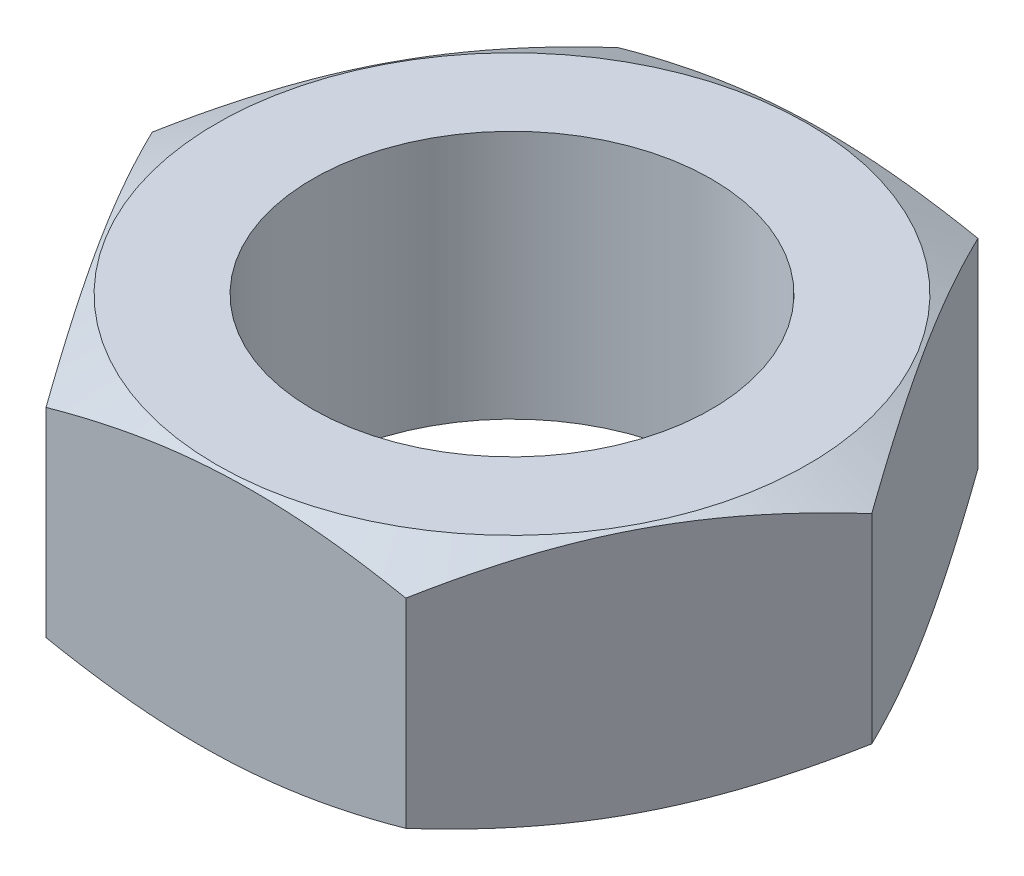
ISO-10303-21;
HEADER;
FILE_DESCRIPTION(('STEP AP214'),'2;1');
FILE_NAME('part.step','',(''),(''),'','','');
FILE_SCHEMA(('AUTOMOTIVE_DESIGN { 1 0 10303 214 1 1 1 1 }'));
ENDSEC;
DATA;
#1=APPLICATION_CONTEXT('core data for automotive mechanical design processes');
#2=APPLICATION_PROTOCOL_DEFINITION('international standard','automotive_design',2000,#1);
#3=PRODUCT_CONTEXT('',#1,'mechanical');
#4=PRODUCT('Part','Part','',(#3));
#5=PRODUCT_RELATED_PRODUCT_CATEGORY('part','',(#4));
#6=PRODUCT_DEFINITION_FORMATION('','',#4);
#7=PRODUCT_DEFINITION_CONTEXT('part definition',#1,'design');
#8=PRODUCT_DEFINITION('design','',#6,#7);
#9=PRODUCT_DEFINITION_SHAPE('','',#8);
#10=(LENGTH_UNIT() NAMED_UNIT(*) SI_UNIT(.MILLI.,.METRE.));
#11=(NAMED_UNIT(*) PLANE_ANGLE_UNIT() SI_UNIT($,.RADIAN.));
#12=(NAMED_UNIT(*) SI_UNIT($,.STERADIAN.) SOLID_ANGLE_UNIT());
#13=UNCERTAINTY_MEASURE_WITH_UNIT(LENGTH_MEASURE(1.E-05),#10,'distance_accuracy_value','');
#14=(GEOMETRIC_REPRESENTATION_CONTEXT(3) GLOBAL_UNCERTAINTY_ASSIGNED_CONTEXT((#13)) GLOBAL_UNIT_ASSIGNED_CONTEXT((#10,
#11,#12)) REPRESENTATION_CONTEXT('',''));
#15=CARTESIAN_POINT('',(0.,0.,0.));
#16=DIRECTION('',(0.,0.,1.));
#17=DIRECTION('',(1.,0.,0.));
#18=AXIS2_PLACEMENT_3D('',#15,#16,#17);
#19=CARTESIAN_POINT('',(6.92194014924689,4.99999999999999,-0.29452431180485));
#20=DIRECTION('',(-0.843987057317929,0.,0.536363540035881));
#21=DIRECTION('',(0.536363540035881,0.,0.843987057317929));
#22=AXIS2_PLACEMENT_3D('',#19,#20,#21);
#23=PLANE('',#22);
#24=CARTESIAN_POINT('',(3.20577743625425,0.500059244134363,-6.14203816862569));
#25=CARTESIAN_POINT('',(3.31051461271701,0.451242167989356,-5.97723050599319));
#26=CARTESIAN_POINT('',(3.41565983679377,0.405322077135247,-5.81178076596491));
#27=CARTESIAN_POINT('',(3.62678777444964,0.320242852522635,-5.47956346646714));
#28=CARTESIAN_POINT('',(3.73277089012844,0.281087200512654,-5.31279527427952));
#29=CARTESIAN_POINT('',(3.9456458760564,0.210503775262007,-4.97782893235048));
#30=CARTESIAN_POINT('',(4.052538859268,0.179087527040338,-4.80962903132315));
#31=CARTESIAN_POINT('',(4.26694862943603,0.12502636456731,-4.4722476519471));
#32=CARTESIAN_POINT('',(4.37446530562581,0.102379938463995,-4.30306634789362));
#33=CARTESIAN_POINT('',(4.58751662943403,0.067053718197412,-3.96782253205453));
#34=CARTESIAN_POINT('',(4.69304094838088,0.0541596026635657,-3.80177627280008));
#35=CARTESIAN_POINT('',(4.90430926275757,0.0379825701147827,-3.46933808555236));
#36=CARTESIAN_POINT('',(5.01005326876448,0.0347001271243317,-3.30294614091569));
#37=CARTESIAN_POINT('',(5.22138456230621,0.0378737368355456,-2.97040885371764));
#38=CARTESIAN_POINT('',(5.32697189592753,0.044319298998566,-2.80426343863751));
#39=CARTESIAN_POINT('',(5.53784564394487,0.0666811412258578,-2.47244611555316));
#40=CARTESIAN_POINT('',(5.64313208322616,0.0825966138886576,-2.30677416839106));
#41=CARTESIAN_POINT('',(5.84659638686395,0.122040366527397,-1.98661586888208));
#42=CARTESIAN_POINT('',(5.94480490127157,0.14502695347487,-1.83208128759249));
#43=CARTESIAN_POINT('',(6.14067023294311,0.198156963128978,-1.52388024003991));
#44=CARTESIAN_POINT('',(6.23832699019221,0.228301149591202,-1.3702138682124));
#45=CARTESIAN_POINT('',(6.43408807357483,0.295367911562853,-1.06217685904057));
#46=CARTESIAN_POINT('',(6.53218524693089,0.332362326408422,-0.907817476845322));
#47=CARTESIAN_POINT('',(6.72765976548517,0.41209697586328,-0.60023138759656));
#48=CARTESIAN_POINT('',(6.82503742494812,0.454834523716835,-0.447004186036328));
#49=CARTESIAN_POINT('',(6.92206725156093,0.500059244134363,-0.2943243118049));
#50=B_SPLINE_CURVE_WITH_KNOTS('',3,(#24,#25,#26,#27,#28,#29,#30,#31,#32,#33,#34,#35,#36,#37,#38,
#39,#40,#41,#42,#43,#44,#45,#46,#47,#48,#49),.UNSPECIFIED.,.F.,.F.,(4,2,2,2,2,2,2,2,2,2,2,2,4),
(0.,0.603877639840611,1.20806518358095,1.81314707831542,2.41812461495599,3.00938619577932,
3.60067693570533,4.19133049177801,4.78193369613622,5.33539537231975,5.88891613249634,
6.44860936518251,7.00804166751778),.UNSPECIFIED.);
#51=CARTESIAN_POINT('',(3.20590453856827,0.5,-6.14183816862572));
#52=VERTEX_POINT('',#51);
#53=CARTESIAN_POINT('',(6.92194014924689,0.5,-0.294524311804892));
#54=VERTEX_POINT('',#53);
#55=EDGE_CURVE('E57',#52,#54,#50,.T.);
#56=ORIENTED_EDGE('',*,*,#55,.F.);
#57=DIRECTION('',(0.,-1.,0.));
#58=VECTOR('',#57,1.);
#59=CARTESIAN_POINT('',(3.20590453856828,4.99999999999999,-6.14183816862568));
#60=LINE('',#59,#58);
#61=CARTESIAN_POINT('',(3.20590453856827,4.49999999999999,-6.14183816862572));
#62=VERTEX_POINT('',#61);
#63=EDGE_CURVE('E50',#62,#52,#60,.T.);
#64=ORIENTED_EDGE('',*,*,#63,.F.);
#65=CARTESIAN_POINT('',(6.92206725156093,4.49994075586564,-0.2943243118049));
#66=CARTESIAN_POINT('',(6.81733007509815,4.54875783201066,-0.459131974437378));
#67=CARTESIAN_POINT('',(6.71218485102138,4.59467792286477,-0.624581714465653));
#68=CARTESIAN_POINT('',(6.50105691336551,4.67975714747739,-0.956799013963414));
#69=CARTESIAN_POINT('',(6.39507379768671,4.71891279948737,-1.12356720615103));
#70=CARTESIAN_POINT('',(6.18219881175876,4.78949622473801,-1.45853354808008));
#71=CARTESIAN_POINT('',(6.07530582854715,4.82091247295968,-1.6267334491074));
#72=CARTESIAN_POINT('',(5.86089605837912,4.87497363543271,-1.96411482848344));
#73=CARTESIAN_POINT('',(5.75337938218935,4.89762006153603,-2.13329613253693));
#74=CARTESIAN_POINT('',(5.54032805838113,4.93294628180261,-2.46853994837601));
#75=CARTESIAN_POINT('',(5.43480373943428,4.94584039733646,-2.63458620763046));
#76=CARTESIAN_POINT('',(5.2235354250576,4.96201742988524,-2.96702439487817));
#77=CARTESIAN_POINT('',(5.11779141905069,4.96529987287569,-3.13341633951485));
#78=CARTESIAN_POINT('',(4.90646012550896,4.96212626316448,-3.4659536267129));
#79=CARTESIAN_POINT('',(4.80087279188763,4.95568070100146,-3.63209904179302));
#80=CARTESIAN_POINT('',(4.5899990438703,4.93331885877416,-3.96391636487737));
#81=CARTESIAN_POINT('',(4.48471260458902,4.91740338611135,-4.12958831203947));
#82=CARTESIAN_POINT('',(4.28124830095122,4.87795963347261,-4.44974661154845));
#83=CARTESIAN_POINT('',(4.1830397865436,4.85497304652515,-4.60428119283805));
#84=CARTESIAN_POINT('',(3.98717445487204,4.80184303687105,-4.91248224039064));
#85=CARTESIAN_POINT('',(3.88951769762295,4.77169885040883,-5.06614861221815));
#86=CARTESIAN_POINT('',(3.69375661424033,4.70463208843717,-5.37418562138998));
#87=CARTESIAN_POINT('',(3.59565944088426,4.6676376735916,-5.52854500358523));
#88=CARTESIAN_POINT('',(3.40018492232998,4.58790302413674,-5.836131092834));
#89=CARTESIAN_POINT('',(3.30280726286704,4.54516547628318,-5.98935829439424));
#90=CARTESIAN_POINT('',(3.20577743625425,4.49994075586564,-6.14203816862569));
#91=B_SPLINE_CURVE_WITH_KNOTS('',3,(#65,#66,#67,#68,#69,#70,#71,#72,#73,#74,#75,#76,#77,#78,#79,
#80,#81,#82,#83,#84,#85,#86,#87,#88,#89,#90),.UNSPECIFIED.,.F.,.F.,(4,2,2,2,2,2,2,2,2,2,2,2,4),
(0.,0.603877639840608,1.20806518358095,1.81314707831541,2.41812461495597,3.00938619577929,
3.60067693570529,4.19133049177798,4.78193369613617,5.33539537231972,5.88891613249633,
6.44860936518251,7.00804166751779),.UNSPECIFIED.);
#92=CARTESIAN_POINT('',(6.92194014924689,4.49999999999999,-0.294524311804892));
#93=VERTEX_POINT('',#92);
#94=EDGE_CURVE('E129',#93,#62,#91,.T.);
#95=ORIENTED_EDGE('',*,*,#94,.F.);
#96=DIRECTION('',(0.,-1.,0.));
#97=VECTOR('',#96,1.);
#98=CARTESIAN_POINT('',(6.92194014924689,4.99999999999999,-0.29452431180485));
#99=LINE('',#98,#97);
#100=EDGE_CURVE('E106',#93,#54,#99,.T.);
#101=ORIENTED_EDGE('',*,*,#100,.T.);
#102=EDGE_LOOP('',(#56,#64,#95,#101));
#103=FACE_BOUND('',#102,.T.);
#104=ADVANCED_FACE('F36',(#103),#23,.F.);
#105=CARTESIAN_POINT('',(3.20590453856828,4.99999999999999,-6.14183816862568));
#106=DIRECTION('',(0.0425109226758603,0.,0.999096002120541));
#107=DIRECTION('',(0.999096002120541,0.,-0.0425109226758603));
#108=AXIS2_PLACEMENT_3D('',#105,#106,#107);
#109=PLANE('',#108);
#110=CARTESIAN_POINT('',(-3.7162356106786,0.500050046325265,-5.84730534694337));
#111=CARTESIAN_POINT('',(-3.52114020071808,0.451233558614801,-5.85560653708889));
#112=CARTESIAN_POINT('',(-3.32528471681809,0.405314059799307,-5.86394006791479));
#113=CARTESIAN_POINT('',(-2.93201375612219,0.320236014630059,-5.88067350630842));
#114=CARTESIAN_POINT('',(-2.73459753034356,0.281080949979113,-5.88907344574489));
#115=CARTESIAN_POINT('',(-2.33807235749717,0.210498685060836,-5.90594534887145));
#116=CARTESIAN_POINT('',(-2.13896133741976,0.179083009232149,-5.91441740076682));
#117=CARTESIAN_POINT('',(-1.73957734853946,0.125022953780818,-5.93141094476382));
#118=CARTESIAN_POINT('',(-1.53930458605811,0.102377062325003,-5.9399324280866));
#119=CARTESIAN_POINT('',(-1.14245097661922,0.0670518354946798,-5.95681830598891));
#120=CARTESIAN_POINT('',(-0.945889368282945,0.0541581827603798,-5.9651818819769));
#121=CARTESIAN_POINT('',(-0.552356977701126,0.0379820046590569,-5.98192644405197));
#122=CARTESIAN_POINT('',(-0.355386175754202,0.0346999533207474,-5.99030743097735));
#123=CARTESIAN_POINT('',(0.0382634945396491,0.0378742585634858,-6.00705698323231));
#124=CARTESIAN_POINT('',(0.234942448749098,0.0443201249688456,-6.01542555221529));
#125=CARTESIAN_POINT('',(0.627739819187143,0.0666824798028249,-6.03213883963365));
#126=CARTESIAN_POINT('',(0.823858281771413,0.0825981608286952,-6.04048356004143));
#127=CARTESIAN_POINT('',(1.20285030932616,0.122041842620647,-6.05660943857958));
#128=CARTESIAN_POINT('',(1.38578098333762,0.145028000646343,-6.06439302666465));
#129=CARTESIAN_POINT('',(1.75061471911711,0.198156800261064,-6.07991647856352));
#130=CARTESIAN_POINT('',(1.93251766912306,0.228300205407827,-6.08765633762191));
#131=CARTESIAN_POINT('',(2.29715721003365,0.295365085554234,-6.1031715266481));
#132=CARTESIAN_POINT('',(2.47988047841606,0.332358394191379,-6.11094628975074));
#133=CARTESIAN_POINT('',(2.84398624861007,0.412090582872495,-6.12643876716002));
#134=CARTESIAN_POINT('',(3.02536933572355,0.454826776537646,-6.1341565063709));
#135=CARTESIAN_POINT('',(3.20610453856829,0.500050046325265,-6.14184667850315));
#136=B_SPLINE_CURVE_WITH_KNOTS('',3,(#110,#111,#112,#113,#114,#115,#116,#117,#118,#119,#120,
#121,#122,#123,#124,#125,#126,#127,#128,#129,#130,#131,#132,#133,#134,#135),.UNSPECIFIED.,.F.,
.F.,(4,2,2,2,2,2,2,2,2,2,2,2,4),(0.,0.603874878153549,1.20805965495954,1.81313873570023,
2.41811345968106,3.00937246524377,3.60066063025813,4.19131163052815,4.78191227871234,
5.33536052994546,5.8888678513365,6.44854729264458,7.00796583529322),.UNSPECIFIED.);
#137=CARTESIAN_POINT('',(-3.71603561067858,0.5,-5.8473138568208));
#138=VERTEX_POINT('',#137);
#139=EDGE_CURVE('E92',#138,#52,#136,.T.);
#140=ORIENTED_EDGE('',*,*,#139,.F.);
#141=DIRECTION('',(0.,-1.,0.));
#142=VECTOR('',#141,1.);
#143=CARTESIAN_POINT('',(-3.71603561067858,4.99999999999999,-5.8473138568208));
#144=LINE('',#143,#142);
#145=CARTESIAN_POINT('',(-3.71603561067858,4.49999999999999,-5.8473138568208));
#146=VERTEX_POINT('',#145);
#147=EDGE_CURVE('E112',#146,#138,#144,.T.);
#148=ORIENTED_EDGE('',*,*,#147,.F.);
#149=CARTESIAN_POINT('',(3.20610453856829,4.49994995367474,-6.14184667850315));
#150=CARTESIAN_POINT('',(3.01100912860776,4.54876644138521,-6.1335454883576));
#151=CARTESIAN_POINT('',(2.81515364470778,4.59468594020071,-6.12521195753168));
#152=CARTESIAN_POINT('',(2.42188268401187,4.67976398536996,-6.10847851913805));
#153=CARTESIAN_POINT('',(2.22446645823324,4.71891905002091,-6.10007857970158));
#154=CARTESIAN_POINT('',(1.82794128538685,4.78950131493918,-6.08320667657502));
#155=CARTESIAN_POINT('',(1.62883026530944,4.82091699076787,-6.07473462467965));
#156=CARTESIAN_POINT('',(1.22944627642914,4.8749770462192,-6.05774108068265));
#157=CARTESIAN_POINT('',(1.02917351394779,4.89762293767502,-6.04921959735987));
#158=CARTESIAN_POINT('',(0.632319904508897,4.93294816450534,-6.03233371945756));
#159=CARTESIAN_POINT('',(0.435758296172623,4.94584181723964,-6.02397014346958));
#160=CARTESIAN_POINT('',(0.0422259055908026,4.96201799534096,-6.0072255813945));
#161=CARTESIAN_POINT('',(-0.154744896356122,4.96530004667927,-5.99884459446912));
#162=CARTESIAN_POINT('',(-0.548394566649975,4.96212574143653,-5.98209504221416));
#163=CARTESIAN_POINT('',(-0.745073520859425,4.95567987503117,-5.97372647323118));
#164=CARTESIAN_POINT('',(-1.13787089129747,4.93331752019719,-5.95701318581282));
#165=CARTESIAN_POINT('',(-1.33398935388174,4.91740183917131,-5.94866846540503));
#166=CARTESIAN_POINT('',(-1.71298138143649,4.87795815737936,-5.93254258686688));
#167=CARTESIAN_POINT('',(-1.89591205544794,4.85497199935367,-5.92475899878182));
#168=CARTESIAN_POINT('',(-2.26074579122743,4.80184319973895,-5.90923554688296));
#169=CARTESIAN_POINT('',(-2.44264874123339,4.77169979459219,-5.90149568782457));
#170=CARTESIAN_POINT('',(-2.80728828214397,4.70463491444578,-5.88598049879837));
#171=CARTESIAN_POINT('',(-2.99001155052638,4.66764160580864,-5.87820573569573));
#172=CARTESIAN_POINT('',(-3.35411732072038,4.58790941712752,-5.86271325828646));
#173=CARTESIAN_POINT('',(-3.53550040783386,4.54517322346237,-5.85499551907559));
#174=CARTESIAN_POINT('',(-3.7162356106786,4.49994995367474,-5.84730534694337));
#175=B_SPLINE_CURVE_WITH_KNOTS('',3,(#149,#150,#151,#152,#153,#154,#155,#156,#157,#158,#159,
#160,#161,#162,#163,#164,#165,#166,#167,#168,#169,#170,#171,#172,#173,#174),.UNSPECIFIED.,.F.,
.F.,(4,2,2,2,2,2,2,2,2,2,2,2,4),(0.,0.603874878153553,1.20805965495955,1.81313873570024,
2.41811345968107,3.00937246524378,3.60066063025814,4.19131163052816,4.78191227871236,
5.33536052994548,5.88886785133651,6.44854729264458,7.00796583529323),.UNSPECIFIED.);
#176=EDGE_CURVE('E111',#62,#146,#175,.T.);
#177=ORIENTED_EDGE('',*,*,#176,.F.);
#178=ORIENTED_EDGE('',*,*,#63,.T.);
#179=EDGE_LOOP('',(#140,#148,#177,#178));
#180=FACE_BOUND('',#179,.T.);
#181=ADVANCED_FACE('F110',(#180),#109,.F.);
#182=CARTESIAN_POINT('',(-3.71603561067858,4.99999999999999,-5.8473138568208));
#183=DIRECTION('',(0.88649797999379,0.,0.462732462084659));
#184=DIRECTION('',(0.462732462084659,0.,-0.88649797999379));
#185=AXIS2_PLACEMENT_3D('',#182,#183,#184);
#186=PLANE('',#185);
#187=CARTESIAN_POINT('',(-6.92204454485126,0.500056403085217,0.294724311804884));
#188=CARTESIAN_POINT('',(-6.83168562507424,0.451239508697742,0.121615644442595));
#189=CARTESIAN_POINT('',(-6.74097467451268,0.40531960071437,-0.0521674397911348));
#190=CARTESIAN_POINT('',(-6.5588302554546,0.32024074041184,-0.40111780051293));
#191=CARTESIAN_POINT('',(-6.4673964400604,0.281085269827085,-0.57628574158392));
#192=CARTESIAN_POINT('',(-6.28374481207704,0.210502202983332,-0.928123597299429));
#193=CARTESIAN_POINT('',(-6.19152603932957,0.179086131564069,-1.10479535140512));
#194=CARTESIAN_POINT('',(-6.0065503282505,0.125025311031029,-1.45916987157766));
#195=CARTESIAN_POINT('',(-5.91379348547884,0.102379050071098,-1.63687245457177));
#196=CARTESIAN_POINT('',(-5.72998973153027,0.0670531366596826,-1.98900175161011));
#197=CARTESIAN_POINT('',(-5.63895173100518,0.0541591640764888,-2.16341139472133));
#198=CARTESIAN_POINT('',(-5.45668621346922,0.037982395451379,-2.51259375463234));
#199=CARTESIAN_POINT('',(-5.36545868733338,0.0347000734352545,-2.68736648891364));
#200=CARTESIAN_POINT('',(-5.18313884101852,0.0378738979834902,-3.03665293132737));
#201=CARTESIAN_POINT('',(-5.09204648107736,0.044319554121318,-3.21116671563571));
#202=CARTESIAN_POINT('',(-4.91012137205678,0.0666815546830291,-3.5596969244962));
#203=CARTESIAN_POINT('',(-4.81928860150811,0.0825970917050462,-3.73371339017893));
#204=CARTESIAN_POINT('',(-4.64375629735216,0.122040822460929,-4.06999633077244));
#205=CARTESIAN_POINT('',(-4.55903031891669,0.145027276922638,-4.23231346840671));
#206=CARTESIAN_POINT('',(-4.39005431656035,0.1981569128175,-4.55603591502624));
#207=CARTESIAN_POINT('',(-4.30580434441144,0.228300857945126,-4.7174411248273));
#208=CARTESIAN_POINT('',(-4.13691828064887,0.295367038653622,-5.0409912680356));
#209=CARTESIAN_POINT('',(-4.05228835973247,0.332361111810394,-5.20312437968596));
#210=CARTESIAN_POINT('',(-3.88364951883075,0.412095001174417,-5.52620089593981));
#211=CARTESIAN_POINT('',(-3.79964032773469,0.454832130742358,-5.68714481993438));
#212=CARTESIAN_POINT('',(-3.7159312150742,0.500056403085217,-5.84751385682082));
#213=B_SPLINE_CURVE_WITH_KNOTS('',3,(#187,#188,#189,#190,#191,#192,#193,#194,#195,#196,#197,
#198,#199,#200,#201,#202,#203,#204,#205,#206,#207,#208,#209,#210,#211,#212),.UNSPECIFIED.,.F.,
.F.,(4,2,2,2,2,2,2,2,2,2,2,2,4),(0.,0.603876786798303,1.20806347587554,1.81314450141095,
2.41812116926452,3.00938195462966,3.60067189920528,4.19132466583007,4.78192708062567,
5.33538461008929,5.88890121927241,6.44859019205446,7.00801824427477),.UNSPECIFIED.);
#214=CARTESIAN_POINT('',(-6.92194014924687,0.5,0.294524311804878));
#215=VERTEX_POINT('',#214);
#216=EDGE_CURVE('E95',#215,#138,#213,.T.);
#217=ORIENTED_EDGE('',*,*,#216,.F.);
#218=DIRECTION('',(0.,-1.,0.));
#219=VECTOR('',#218,1.);
#220=CARTESIAN_POINT('',(-6.92194014924687,4.99999999999999,0.294524311804906));
#221=LINE('',#220,#219);
#222=CARTESIAN_POINT('',(-6.92194014924687,4.49999999999999,0.294524311804878));
#223=VERTEX_POINT('',#222);
#224=EDGE_CURVE('E113',#223,#215,#221,.T.);
#225=ORIENTED_EDGE('',*,*,#224,.F.);
#226=CARTESIAN_POINT('',(-3.7159312150742,4.49994359691479,-5.84751385682082));
#227=CARTESIAN_POINT('',(-3.80629013485121,4.54876049130226,-5.67440518945852));
#228=CARTESIAN_POINT('',(-3.89700108541277,4.59468039928564,-5.50062210522479));
#229=CARTESIAN_POINT('',(-4.07914550447084,4.67975925958817,-5.15167174450298));
#230=CARTESIAN_POINT('',(-4.17057931986504,4.71891473017292,-4.97650380343199));
#231=CARTESIAN_POINT('',(-4.3542309478484,4.78949779701668,-4.62466594771648));
#232=CARTESIAN_POINT('',(-4.44644972059588,4.82091386843594,-4.44799419361079));
#233=CARTESIAN_POINT('',(-4.63142543167495,4.87497468896898,-4.09361967343825));
#234=CARTESIAN_POINT('',(-4.7241822744466,4.89762094992891,-3.91591709044413));
#235=CARTESIAN_POINT('',(-4.90798602839518,4.93294686334033,-3.5637877934058));
#236=CARTESIAN_POINT('',(-4.99902402892027,4.94584083592352,-3.38937815029457));
#237=CARTESIAN_POINT('',(-5.18128954645623,4.96201760454863,-3.04019579038356));
#238=CARTESIAN_POINT('',(-5.27251707259207,4.96529992656475,-2.86542305610226));
#239=CARTESIAN_POINT('',(-5.45483691890693,4.96212610201652,-2.51613661368852));
#240=CARTESIAN_POINT('',(-5.54592927884809,4.9556804458787,-2.34162282938017));
#241=CARTESIAN_POINT('',(-5.72785438786868,4.93331844531698,-1.99309262051969));
#242=CARTESIAN_POINT('',(-5.81868715841737,4.91740290829495,-1.81907615483697));
#243=CARTESIAN_POINT('',(-5.99421946257332,4.87795917753906,-1.48279321424346));
#244=CARTESIAN_POINT('',(-6.07894544100877,4.85497272307737,-1.32047607660919));
#245=CARTESIAN_POINT('',(-6.2479214433651,4.80184308718252,-0.996753629989655));
#246=CARTESIAN_POINT('',(-6.33217141551401,4.77169914205489,-0.835348420188599));
#247=CARTESIAN_POINT('',(-6.50105747927658,4.70463296134639,-0.511798276980304));
#248=CARTESIAN_POINT('',(-6.58568740019297,4.66763888818962,-0.349665165329948));
#249=CARTESIAN_POINT('',(-6.7543262410947,4.5879049988256,-0.026588649076102));
#250=CARTESIAN_POINT('',(-6.83833543219076,4.54516786925766,0.134355274918462));
#251=CARTESIAN_POINT('',(-6.92204454485126,4.49994359691479,0.294724311804884));
#252=B_SPLINE_CURVE_WITH_KNOTS('',3,(#226,#227,#228,#229,#230,#231,#232,#233,#234,#235,#236,
#237,#238,#239,#240,#241,#242,#243,#244,#245,#246,#247,#248,#249,#250,#251),.UNSPECIFIED.,.F.,
.F.,(4,2,2,2,2,2,2,2,2,2,2,2,4),(0.,0.60387678679831,1.20806347587555,1.81314450141096,
2.41812116926454,3.00938195462969,3.60067189920531,4.19132466583011,4.78192708062572,
5.33538461008932,5.88890121927244,6.44859019205447,7.00801824427477),.UNSPECIFIED.);
#253=EDGE_CURVE('E166',#146,#223,#252,.T.);
#254=ORIENTED_EDGE('',*,*,#253,.F.);
#255=ORIENTED_EDGE('',*,*,#147,.T.);
#256=EDGE_LOOP('',(#217,#225,#254,#255));
#257=FACE_BOUND('',#256,.T.);
#258=ADVANCED_FACE('F171',(#257),#186,.F.);
#259=CARTESIAN_POINT('',(-6.92194014924687,4.99999999999999,0.294524311804906));
#260=DIRECTION('',(0.843987057317929,0.,-0.536363540035882));
#261=DIRECTION('',(-0.536363540035882,0.,-0.843987057317929));
#262=AXIS2_PLACEMENT_3D('',#259,#260,#261);
#263=PLANE('',#262);
#264=CARTESIAN_POINT('',(-3.20577743625421,0.500059244134363,6.14203816862569));
#265=CARTESIAN_POINT('',(-3.31051461271699,0.451242167989361,5.97723050599321));
#266=CARTESIAN_POINT('',(-3.41565983679376,0.405322077135254,5.81178076596493));
#267=CARTESIAN_POINT('',(-3.62678777444963,0.320242852522643,5.47956346646717));
#268=CARTESIAN_POINT('',(-3.73277089012843,0.281087200512661,5.31279527427955));
#269=CARTESIAN_POINT('',(-3.94564587605638,0.210503775262014,4.9778289323505));
#270=CARTESIAN_POINT('',(-4.05253885926799,0.179087527040345,4.80962903132319));
#271=CARTESIAN_POINT('',(-4.26694862943602,0.125026364567317,4.47224765194713));
#272=CARTESIAN_POINT('',(-4.3744653056258,0.102379938464001,4.30306634789365));
#273=CARTESIAN_POINT('',(-4.58751662943402,0.0670537181974177,3.96782253205457));
#274=CARTESIAN_POINT('',(-4.69304094838087,0.0541596026635706,3.80177627280012));
#275=CARTESIAN_POINT('',(-4.90430926275755,0.0379825701147863,3.4693380855524));
#276=CARTESIAN_POINT('',(-5.01005326876446,0.0347001271243346,3.30294614091573));
#277=CARTESIAN_POINT('',(-5.22138456230619,0.037873736835547,2.97040885371768));
#278=CARTESIAN_POINT('',(-5.32697189592751,0.0443192989985665,2.80426343863755));
#279=CARTESIAN_POINT('',(-5.53784564394484,0.066681141225858,2.4724461155532));
#280=CARTESIAN_POINT('',(-5.64313208322613,0.0825966138886586,2.3067741683911));
#281=CARTESIAN_POINT('',(-5.84659638686393,0.122040366527397,1.98661586888212));
#282=CARTESIAN_POINT('',(-5.94480490127155,0.145026953474868,1.83208128759252));
#283=CARTESIAN_POINT('',(-6.14067023294311,0.198156963128976,1.52388024003993));
#284=CARTESIAN_POINT('',(-6.2383269901922,0.228301149591201,1.37021386821242));
#285=CARTESIAN_POINT('',(-6.43408807357482,0.295367911562854,1.06217685904059));
#286=CARTESIAN_POINT('',(-6.5321852469309,0.332362326408424,0.907817476845333));
#287=CARTESIAN_POINT('',(-6.72765976548517,0.412096975863283,0.600231387596559));
#288=CARTESIAN_POINT('',(-6.82503742494812,0.454834523716837,0.447004186036318));
#289=CARTESIAN_POINT('',(-6.92206725156091,0.500059244134363,0.294324311804872));
#290=B_SPLINE_CURVE_WITH_KNOTS('',3,(#264,#265,#266,#267,#268,#269,#270,#271,#272,#273,#274,
#275,#276,#277,#278,#279,#280,#281,#282,#283,#284,#285,#286,#287,#288,#289),.UNSPECIFIED.,.F.,
.F.,(4,2,2,2,2,2,2,2,2,2,2,2,4),(0.,0.603877639840606,1.20806518358095,1.81314707831541,
2.41812461495597,3.0093861957793,3.6006769357053,4.19133049177799,4.78193369613619,
5.33539537231973,5.88891613249635,6.44860936518253,7.00804166751782),.UNSPECIFIED.);
#291=CARTESIAN_POINT('',(-3.20590453856827,0.5,6.14183816862574));
#292=VERTEX_POINT('',#291);
#293=EDGE_CURVE('E184',#292,#215,#290,.T.);
#294=ORIENTED_EDGE('',*,*,#293,.F.);
#295=DIRECTION('',(0.,-1.,0.));
#296=VECTOR('',#295,1.);
#297=CARTESIAN_POINT('',(-3.20590453856827,4.99999999999999,6.14183816862571));
#298=LINE('',#297,#296);
#299=CARTESIAN_POINT('',(-3.20590453856827,4.49999999999999,6.14183816862574));
#300=VERTEX_POINT('',#299);
#301=EDGE_CURVE('E118',#300,#292,#298,.T.);
#302=ORIENTED_EDGE('',*,*,#301,.F.);
#303=CARTESIAN_POINT('',(-6.92206725156091,4.49994075586564,0.294324311804872));
#304=CARTESIAN_POINT('',(-6.81733007509815,4.54875783201065,0.459131974437364));
#305=CARTESIAN_POINT('',(-6.71218485102139,4.59467792286476,0.624581714465645));
#306=CARTESIAN_POINT('',(-6.50105691336552,4.67975714747737,0.956799013963413));
#307=CARTESIAN_POINT('',(-6.39507379768672,4.71891279948735,1.12356720615103));
#308=CARTESIAN_POINT('',(-6.18219881175876,4.789496224738,1.45853354808008));
#309=CARTESIAN_POINT('',(-6.07530582854715,4.82091247295967,1.6267334491074));
#310=CARTESIAN_POINT('',(-5.86089605837912,4.8749736354327,1.96411482848345));
#311=CARTESIAN_POINT('',(-5.75337938218935,4.89762006153601,2.13329613253694));
#312=CARTESIAN_POINT('',(-5.54032805838113,4.93294628180259,2.46853994837602));
#313=CARTESIAN_POINT('',(-5.43480373943427,4.94584039733644,2.63458620763047));
#314=CARTESIAN_POINT('',(-5.22353542505759,4.96201742988523,2.96702439487819));
#315=CARTESIAN_POINT('',(-5.11779141905068,4.96529987287568,3.13341633951487));
#316=CARTESIAN_POINT('',(-4.90646012550895,4.96212626316446,3.46595362671292));
#317=CARTESIAN_POINT('',(-4.80087279188762,4.95568070100145,3.63209904179305));
#318=CARTESIAN_POINT('',(-4.58999904387029,4.93331885877415,3.9639163648774));
#319=CARTESIAN_POINT('',(-4.48471260458901,4.91740338611135,4.12958831203949));
#320=CARTESIAN_POINT('',(-4.28124830095121,4.87795963347261,4.44974661154848));
#321=CARTESIAN_POINT('',(-4.18303978654359,4.85497304652514,4.60428119283808));
#322=CARTESIAN_POINT('',(-3.98717445487203,4.80184303687104,4.91248224039066));
#323=CARTESIAN_POINT('',(-3.88951769762294,4.77169885040881,5.06614861221817));
#324=CARTESIAN_POINT('',(-3.69375661424032,4.70463208843716,5.37418562139));
#325=CARTESIAN_POINT('',(-3.59565944088425,4.66763767359159,5.52854500358526));
#326=CARTESIAN_POINT('',(-3.40018492232997,4.58790302413673,5.83613109283402));
#327=CARTESIAN_POINT('',(-3.30280726286702,4.54516547628317,5.98935829439426));
#328=CARTESIAN_POINT('',(-3.20577743625421,4.49994075586564,6.14203816862569));
#329=B_SPLINE_CURVE_WITH_KNOTS('',3,(#303,#304,#305,#306,#307,#308,#309,#310,#311,#312,#313,
#314,#315,#316,#317,#318,#319,#320,#321,#322,#323,#324,#325,#326,#327,#328),.UNSPECIFIED.,.F.,
.F.,(4,2,2,2,2,2,2,2,2,2,2,2,4),(0.,0.603877639840611,1.20806518358095,1.81314707831542,
2.41812461495599,3.00938619577931,3.60067693570532,4.19133049177801,4.78193369613622,
5.33539537231976,5.88891613249636,6.44860936518254,7.00804166751782),.UNSPECIFIED.);
#330=EDGE_CURVE('E161',#223,#300,#329,.T.);
#331=ORIENTED_EDGE('',*,*,#330,.F.);
#332=ORIENTED_EDGE('',*,*,#224,.T.);
#333=EDGE_LOOP('',(#294,#302,#331,#332));
#334=FACE_BOUND('',#333,.T.);
#335=ADVANCED_FACE('F174',(#334),#263,.F.);
#336=CARTESIAN_POINT('',(-3.20590453856827,4.99999999999999,6.14183816862571));
#337=DIRECTION('',(-0.0425109226758608,0.,-0.999096002120541));
#338=DIRECTION('',(-0.999096002120541,0.,0.0425109226758608));
#339=AXIS2_PLACEMENT_3D('',#336,#337,#338);
#340=PLANE('',#339);
#341=CARTESIAN_POINT('',(3.71623561067862,0.500050046325265,5.84730534694337));
#342=CARTESIAN_POINT('',(3.52114020071809,0.45123355861481,5.85560653708891));
#343=CARTESIAN_POINT('',(3.32528471681811,0.405314059799319,5.86394006791482));
#344=CARTESIAN_POINT('',(2.9320137561222,0.320236014630073,5.88067350630844));
#345=CARTESIAN_POINT('',(2.73459753034357,0.281080949979127,5.88907344574492));
#346=CARTESIAN_POINT('',(2.33807235749718,0.21049868506085,5.90594534887147));
#347=CARTESIAN_POINT('',(2.13896133741977,0.179083009232162,5.91441740076684));
#348=CARTESIAN_POINT('',(1.73957734853947,0.125022953780832,5.93141094476385));
#349=CARTESIAN_POINT('',(1.53930458605812,0.102377062325017,5.93993242808663));
#350=CARTESIAN_POINT('',(1.14245097661922,0.0670518354946931,5.95681830598894));
#351=CARTESIAN_POINT('',(0.945889368282951,0.0541581827603932,5.96518188197692));
#352=CARTESIAN_POINT('',(0.55235697770113,0.0379820046590697,5.981926444052));
#353=CARTESIAN_POINT('',(0.355386175754205,0.0346999533207596,5.99030743097737));
#354=CARTESIAN_POINT('',(-0.0382634945396468,0.0378742585635001,6.00705698323234));
#355=CARTESIAN_POINT('',(-0.234942448749095,0.0443201249688626,6.01542555221532));
#356=CARTESIAN_POINT('',(-0.627739819187142,0.0666824798028346,6.03213883963367));
#357=CARTESIAN_POINT('',(-0.823858281771413,0.0825981608286948,6.04048356004144));
#358=CARTESIAN_POINT('',(-1.20285030932616,0.122041842620647,6.05660943857959));
#359=CARTESIAN_POINT('',(-1.38578098333761,0.145028000646353,6.06439302666467));
#360=CARTESIAN_POINT('',(-1.7506147191171,0.19815680026108,6.07991647856355));
#361=CARTESIAN_POINT('',(-1.93251766912305,0.228300205407839,6.08765633762193));
#362=CARTESIAN_POINT('',(-2.29715721003364,0.295365085554244,6.10317152664812));
#363=CARTESIAN_POINT('',(-2.47988047841605,0.33235839419139,6.11094628975076));
#364=CARTESIAN_POINT('',(-2.84398624861005,0.412090582872505,6.12643876716005));
#365=CARTESIAN_POINT('',(-3.02536933572353,0.454826776537654,6.13415650637092));
#366=CARTESIAN_POINT('',(-3.20610453856827,0.500050046325265,6.14184667850318));
#367=B_SPLINE_CURVE_WITH_KNOTS('',3,(#341,#342,#343,#344,#345,#346,#347,#348,#349,#350,#351,
#352,#353,#354,#355,#356,#357,#358,#359,#360,#361,#362,#363,#364,#365,#366),.UNSPECIFIED.,.F.,
.F.,(4,2,2,2,2,2,2,2,2,2,2,2,4),(0.,0.603874878153549,1.20805965495954,1.81313873570023,
2.41811345968106,3.00937246524377,3.60066063025813,4.19131163052816,4.78191227871235,
5.33536052994547,5.8888678513365,6.44854729264458,7.00796583529322),.UNSPECIFIED.);
#368=CARTESIAN_POINT('',(3.71603561067861,0.5,5.84731385682084));
#369=VERTEX_POINT('',#368);
#370=EDGE_CURVE('E210',#369,#292,#367,.T.);
#371=ORIENTED_EDGE('',*,*,#370,.F.);
#372=DIRECTION('',(0.,-1.,0.));
#373=VECTOR('',#372,1.);
#374=CARTESIAN_POINT('',(3.71603561067861,4.99999999999999,5.84731385682084));
#375=LINE('',#374,#373);
#376=CARTESIAN_POINT('',(3.71603561067861,4.49999999999999,5.84731385682084));
#377=VERTEX_POINT('',#376);
#378=EDGE_CURVE('E121',#377,#369,#375,.T.);
#379=ORIENTED_EDGE('',*,*,#378,.F.);
#380=CARTESIAN_POINT('',(-3.20610453856827,4.49994995367474,6.14184667850318));
#381=CARTESIAN_POINT('',(-3.01100912860775,4.5487664413852,6.13354548835763));
#382=CARTESIAN_POINT('',(-2.81515364470776,4.5946859402007,6.12521195753171));
#383=CARTESIAN_POINT('',(-2.42188268401186,4.67976398536994,6.10847851913808));
#384=CARTESIAN_POINT('',(-2.22446645823323,4.71891905002089,6.1000785797016));
#385=CARTESIAN_POINT('',(-1.82794128538683,4.78950131493917,6.08320667657505));
#386=CARTESIAN_POINT('',(-1.62883026530942,4.82091699076785,6.07473462467968));
#387=CARTESIAN_POINT('',(-1.22944627642913,4.87497704621918,6.05774108068267));
#388=CARTESIAN_POINT('',(-1.02917351394778,4.897622937675,6.0492195973599));
#389=CARTESIAN_POINT('',(-0.632319904508882,4.93294816450532,6.03233371945759));
#390=CARTESIAN_POINT('',(-0.435758296172609,4.94584181723962,6.0239701434696));
#391=CARTESIAN_POINT('',(-0.0422259055907882,4.96201799534095,6.00722558139452));
#392=CARTESIAN_POINT('',(0.154744896356136,4.96530004667926,5.99884459446915));
#393=CARTESIAN_POINT('',(0.548394566649989,4.96212574143652,5.98209504221419));
#394=CARTESIAN_POINT('',(0.745073520859438,4.95567987503116,5.97372647323121));
#395=CARTESIAN_POINT('',(1.13787089129748,4.93331752019718,5.95701318581284));
#396=CARTESIAN_POINT('',(1.33398935388175,4.91740183917131,5.94866846540505));
#397=CARTESIAN_POINT('',(1.7129813814365,4.87795815737936,5.93254258686691));
#398=CARTESIAN_POINT('',(1.89591205544796,4.85497199935366,5.92475899878184));
#399=CARTESIAN_POINT('',(2.26074579122745,4.80184319973894,5.90923554688298));
#400=CARTESIAN_POINT('',(2.4426487412334,4.77169979459218,5.90149568782459));
#401=CARTESIAN_POINT('',(2.80728828214399,4.70463491444577,5.8859804987984));
#402=CARTESIAN_POINT('',(2.99001155052639,4.66764160580863,5.87820573569576));
#403=CARTESIAN_POINT('',(3.3541173207204,4.58790941712751,5.86271325828648));
#404=CARTESIAN_POINT('',(3.53550040783388,4.54517322346236,5.85499551907561));
#405=CARTESIAN_POINT('',(3.71623561067862,4.49994995367474,5.84730534694337));
#406=B_SPLINE_CURVE_WITH_KNOTS('',3,(#380,#381,#382,#383,#384,#385,#386,#387,#388,#389,#390,
#391,#392,#393,#394,#395,#396,#397,#398,#399,#400,#401,#402,#403,#404,#405),.UNSPECIFIED.,.F.,
.F.,(4,2,2,2,2,2,2,2,2,2,2,2,4),(0.,0.603874878153552,1.20805965495954,1.81313873570023,
2.41811345968107,3.00937246524378,3.60066063025814,4.19131163052816,4.78191227871235,
5.33536052994548,5.88886785133651,6.44854729264458,7.00796583529322),.UNSPECIFIED.);
#407=EDGE_CURVE('E64',#300,#377,#406,.T.);
#408=ORIENTED_EDGE('',*,*,#407,.F.);
#409=ORIENTED_EDGE('',*,*,#301,.T.);
#410=EDGE_LOOP('',(#371,#379,#408,#409));
#411=FACE_BOUND('',#410,.T.);
#412=ADVANCED_FACE('F208',(#411),#340,.F.);
#413=CARTESIAN_POINT('',(3.71603561067861,4.99999999999999,5.84731385682084));
#414=DIRECTION('',(-0.88649797999379,0.,-0.462732462084659));
#415=DIRECTION('',(-0.462732462084659,0.,0.88649797999379));
#416=AXIS2_PLACEMENT_3D('',#413,#414,#415);
#417=PLANE('',#416);
#418=CARTESIAN_POINT('',(6.92204454485128,0.500056403085217,-0.294724311804898));
#419=CARTESIAN_POINT('',(6.83168562507427,0.451239508697756,-0.121615644442595));
#420=CARTESIAN_POINT('',(6.74097467451272,0.40531960071439,0.0521674397911426));
#421=CARTESIAN_POINT('',(6.55883025545464,0.320240740411865,0.401117800512944));
#422=CARTESIAN_POINT('',(6.46739644006045,0.281085269827108,0.576285741583934));
#423=CARTESIAN_POINT('',(6.28374481207708,0.210502202983354,0.928123597299446));
#424=CARTESIAN_POINT('',(6.19152603932961,0.17908613156409,1.10479535140513));
#425=CARTESIAN_POINT('',(6.00655032825054,0.12502531103105,1.45916987157768));
#426=CARTESIAN_POINT('',(5.91379348547888,0.102379050071119,1.6368724545718));
#427=CARTESIAN_POINT('',(5.7299897315303,0.0670531366597037,1.98900175161014));
#428=CARTESIAN_POINT('',(5.63895173100521,0.0541591640765105,2.16341139472137));
#429=CARTESIAN_POINT('',(5.45668621346925,0.0379823954514001,2.51259375463238));
#430=CARTESIAN_POINT('',(5.36545868733341,0.0347000734352744,2.68736648891368));
#431=CARTESIAN_POINT('',(5.18313884101855,0.0378738979835145,3.03665293132742));
#432=CARTESIAN_POINT('',(5.09204648107739,0.044319554121348,3.21116671563576));
#433=CARTESIAN_POINT('',(4.9101213720568,0.0666815546830464,3.55969692449625));
#434=CARTESIAN_POINT('',(4.81928860150811,0.082597091705045,3.73371339017897));
#435=CARTESIAN_POINT('',(4.64375629735216,0.122040822460929,4.06999633077248));
#436=CARTESIAN_POINT('',(4.55903031891671,0.145027276922656,4.23231346840675));
#437=CARTESIAN_POINT('',(4.39005431656038,0.198156912817531,4.55603591502628));
#438=CARTESIAN_POINT('',(4.30580434441147,0.228300857945153,4.71744112482734));
#439=CARTESIAN_POINT('',(4.1369182806489,0.295367038653645,5.04099126803564));
#440=CARTESIAN_POINT('',(4.05228835973251,0.332361111810419,5.20312437968599));
#441=CARTESIAN_POINT('',(3.88364951883078,0.412095001174438,5.52620089593984));
#442=CARTESIAN_POINT('',(3.79964032773471,0.454832130742374,5.68714481993441));
#443=CARTESIAN_POINT('',(3.7159312150742,0.500056403085217,5.84751385682083));
#444=B_SPLINE_CURVE_WITH_KNOTS('',3,(#418,#419,#420,#421,#422,#423,#424,#425,#426,#427,#428,
#429,#430,#431,#432,#433,#434,#435,#436,#437,#438,#439,#440,#441,#442,#443),.UNSPECIFIED.,.F.,
.F.,(4,2,2,2,2,2,2,2,2,2,2,2,4),(0.,0.603876786798306,1.20806347587554,1.81314450141096,
2.41812116926454,3.00938195462969,3.60067189920532,4.19132466583011,4.78192708062572,
5.33538461008933,5.88890121927245,6.44859019205449,7.00801824427479),.UNSPECIFIED.);
#445=EDGE_CURVE('E211',#54,#369,#444,.T.);
#446=ORIENTED_EDGE('',*,*,#445,.F.);
#447=ORIENTED_EDGE('',*,*,#100,.F.);
#448=CARTESIAN_POINT('',(3.7159312150742,4.49994359691479,5.84751385682083));
#449=CARTESIAN_POINT('',(3.80629013485123,4.54876049130225,5.67440518945854));
#450=CARTESIAN_POINT('',(3.8970010854128,4.59468039928562,5.50062210522481));
#451=CARTESIAN_POINT('',(4.07914550447088,4.67975925958815,5.15167174450301));
#452=CARTESIAN_POINT('',(4.17057931986507,4.71891473017291,4.97650380343202));
#453=CARTESIAN_POINT('',(4.35423094784844,4.78949779701667,4.62466594771651));
#454=CARTESIAN_POINT('',(4.44644972059591,4.82091386843593,4.44799419361082));
#455=CARTESIAN_POINT('',(4.63142543167498,4.87497468896897,4.09361967343827));
#456=CARTESIAN_POINT('',(4.72418227444664,4.8976209499289,3.91591709044415));
#457=CARTESIAN_POINT('',(4.90798602839522,4.93294686334032,3.56378779340581));
#458=CARTESIAN_POINT('',(4.99902402892031,4.94584083592351,3.38937815029459));
#459=CARTESIAN_POINT('',(5.18128954645627,4.96201760454862,3.04019579038357));
#460=CARTESIAN_POINT('',(5.27251707259211,4.96529992656475,2.86542305610228));
#461=CARTESIAN_POINT('',(5.45483691890697,4.96212610201651,2.51613661368853));
#462=CARTESIAN_POINT('',(5.54592927884814,4.95568044587869,2.34162282938019));
#463=CARTESIAN_POINT('',(5.72785438786871,4.93331844531697,1.99309262051969));
#464=CARTESIAN_POINT('',(5.81868715841737,4.91740290829494,1.81907615483695));
#465=CARTESIAN_POINT('',(5.99421946257332,4.87795917753906,1.48279321424344));
#466=CARTESIAN_POINT('',(6.0789454410088,4.85497272307736,1.32047607660919));
#467=CARTESIAN_POINT('',(6.24792144336516,4.8018430871825,0.996753629989671));
#468=CARTESIAN_POINT('',(6.33217141551405,4.77169914205488,0.835348420188609));
#469=CARTESIAN_POINT('',(6.50105747927662,4.70463296134638,0.511798276980311));
#470=CARTESIAN_POINT('',(6.58568740019301,4.66763888818961,0.349665165329956));
#471=CARTESIAN_POINT('',(6.75432624109474,4.58790499882559,0.0265886490761072));
#472=CARTESIAN_POINT('',(6.8383354321908,4.54516786925765,-0.134355274918461));
#473=CARTESIAN_POINT('',(6.92204454485128,4.49994359691479,-0.294724311804898));
#474=B_SPLINE_CURVE_WITH_KNOTS('',3,(#448,#449,#450,#451,#452,#453,#454,#455,#456,#457,#458,
#459,#460,#461,#462,#463,#464,#465,#466,#467,#468,#469,#470,#471,#472,#473),.UNSPECIFIED.,.F.,
.F.,(4,2,2,2,2,2,2,2,2,2,2,2,4),(0.,0.603876786798312,1.20806347587555,1.81314450141097,
2.41812116926455,3.0093819546297,3.60067189920533,4.19132466583013,4.78192708062574,
5.33538461008935,5.88890121927246,6.4485901920545,7.0080182442748),.UNSPECIFIED.);
#475=EDGE_CURVE('E11',#377,#93,#474,.T.);
#476=ORIENTED_EDGE('',*,*,#475,.F.);
#477=ORIENTED_EDGE('',*,*,#378,.T.);
#478=EDGE_LOOP('',(#446,#447,#476,#477));
#479=FACE_BOUND('',#478,.T.);
#480=ADVANCED_FACE('F224',(#479),#417,.F.);
#481=CARTESIAN_POINT('',(0.,5.00000000000002,0.));
#482=DIRECTION('',(0.,1.,0.));
#483=DIRECTION('',(0.,0.,1.));
#484=AXIS2_PLACEMENT_3D('',#481,#482,#483);
#485=PLANE('',#484);
#486=CARTESIAN_POINT('',(0.,5.00000000000002,0.));
#487=DIRECTION('',(0.,-1.,0.));
#488=DIRECTION('',(0.,0.,-1.));
#489=AXIS2_PLACEMENT_3D('',#486,#487,#488);
#490=CIRCLE('',#489,5.92820323027551);
#491=CARTESIAN_POINT('',(0.,5.00000000000002,-5.92820323027551));
#492=VERTEX_POINT('',#491);
#493=EDGE_CURVE('E107',#492,#492,#490,.T.);
#494=ORIENTED_EDGE('',*,*,#493,.F.);
#495=EDGE_LOOP('',(#494));
#496=FACE_BOUND('',#495,.T.);
#497=CARTESIAN_POINT('',(0.,5.00000000000002,0.));
#498=DIRECTION('',(0.,1.,0.));
#499=DIRECTION('',(0.,0.,1.));
#500=AXIS2_PLACEMENT_3D('',#497,#498,#499);
#501=CIRCLE('',#500,4.);
#502=CARTESIAN_POINT('',(0.,5.00000000000002,4.));
#503=VERTEX_POINT('',#502);
#504=EDGE_CURVE('E125',#503,#503,#501,.T.);
#505=ORIENTED_EDGE('',*,*,#504,.F.);
#506=EDGE_LOOP('',(#505));
#507=FACE_BOUND('',#506,.T.);
#508=ADVANCED_FACE('F229',(#496,#507),#485,.T.);
#509=CARTESIAN_POINT('',(0.,0.,0.));
#510=DIRECTION('',(0.,1.,0.));
#511=DIRECTION('',(0.,0.,1.));
#512=AXIS2_PLACEMENT_3D('',#509,#510,#511);
#513=PLANE('',#512);
#514=CARTESIAN_POINT('',(0.,0.,0.));
#515=DIRECTION('',(0.,-1.,0.));
#516=DIRECTION('',(0.,0.,-1.));
#517=AXIS2_PLACEMENT_3D('',#514,#515,#516);
#518=CIRCLE('',#517,5.92820323027551);
#519=CARTESIAN_POINT('',(0.,0.,-5.92820323027551));
#520=VERTEX_POINT('',#519);
#521=EDGE_CURVE('E213',#520,#520,#518,.T.);
#522=ORIENTED_EDGE('',*,*,#521,.T.);
#523=EDGE_LOOP('',(#522));
#524=FACE_BOUND('',#523,.T.);
#525=CARTESIAN_POINT('',(0.,0.,0.));
#526=DIRECTION('',(0.,1.,0.));
#527=DIRECTION('',(0.,0.,1.));
#528=AXIS2_PLACEMENT_3D('',#525,#526,#527);
#529=CIRCLE('',#528,4.);
#530=CARTESIAN_POINT('',(0.,0.,4.));
#531=VERTEX_POINT('',#530);
#532=EDGE_CURVE('E126',#531,#531,#529,.T.);
#533=ORIENTED_EDGE('',*,*,#532,.T.);
#534=EDGE_LOOP('',(#533));
#535=FACE_BOUND('',#534,.T.);
#536=ADVANCED_FACE('F231',(#524,#535),#513,.F.);
#537=CARTESIAN_POINT('',(0.,5.00000000000002,0.));
#538=DIRECTION('',(0.,-1.,0.));
#539=DIRECTION('',(0.,0.,-1.));
#540=AXIS2_PLACEMENT_3D('',#537,#538,#539);
#541=CYLINDRICAL_SURFACE('',#540,4.);
#542=ORIENTED_EDGE('',*,*,#504,.T.);
#543=EDGE_LOOP('',(#542));
#544=FACE_BOUND('',#543,.T.);
#545=ORIENTED_EDGE('',*,*,#532,.F.);
#546=EDGE_LOOP('',(#545));
#547=FACE_BOUND('',#546,.T.);
#548=ADVANCED_FACE('F145',(#544,#547),#541,.F.);
#549=CARTESIAN_POINT('',(0.,4.50000000000002,0.));
#550=DIRECTION('',(0.,-1.,0.));
#551=DIRECTION('',(0.,0.,-1.));
#552=AXIS2_PLACEMENT_3D('',#549,#550,#551);
#553=CONICAL_SURFACE('',#552,6.92820323027551,1.10714871779409);
#554=ORIENTED_EDGE('',*,*,#493,.T.);
#555=EDGE_LOOP('',(#554));
#556=FACE_BOUND('',#555,.T.);
#557=ORIENTED_EDGE('',*,*,#94,.T.);
#558=ORIENTED_EDGE('',*,*,#176,.T.);
#559=ORIENTED_EDGE('',*,*,#253,.T.);
#560=ORIENTED_EDGE('',*,*,#330,.T.);
#561=ORIENTED_EDGE('',*,*,#407,.T.);
#562=ORIENTED_EDGE('',*,*,#475,.T.);
#563=EDGE_LOOP('',(#557,#558,#559,#560,#561,#562));
#564=FACE_BOUND('',#563,.T.);
#565=ADVANCED_FACE('F140',(#556,#564),#553,.T.);
#566=CARTESIAN_POINT('',(0.,0.,0.));
#567=DIRECTION('',(0.,1.,0.));
#568=DIRECTION('',(0.,0.,1.));
#569=AXIS2_PLACEMENT_3D('',#566,#567,#568);
#570=CONICAL_SURFACE('',#569,5.92820323027551,1.10714871779409);
#571=ORIENTED_EDGE('',*,*,#521,.F.);
#572=EDGE_LOOP('',(#571));
#573=FACE_BOUND('',#572,.T.);
#574=ORIENTED_EDGE('',*,*,#55,.T.);
#575=ORIENTED_EDGE('',*,*,#445,.T.);
#576=ORIENTED_EDGE('',*,*,#370,.T.);
#577=ORIENTED_EDGE('',*,*,#293,.T.);
#578=ORIENTED_EDGE('',*,*,#216,.T.);
#579=ORIENTED_EDGE('',*,*,#139,.T.);
#580=EDGE_LOOP('',(#574,#575,#576,#577,#578,#579));
#581=FACE_BOUND('',#580,.T.);
#582=ADVANCED_FACE('F93',(#573,#581),#570,.T.);
#583=CLOSED_SHELL('',(#104,#181,#258,#335,#412,#480,#508,#536,#548,#565,#582));
#584=MANIFOLD_SOLID_BREP('B2',#583);
#585=ADVANCED_BREP_SHAPE_REPRESENTATION('',(#18,#584),#14);
#586=SHAPE_DEFINITION_REPRESENTATION(#9,#585);
ENDSEC;
END-ISO-10303-21;
